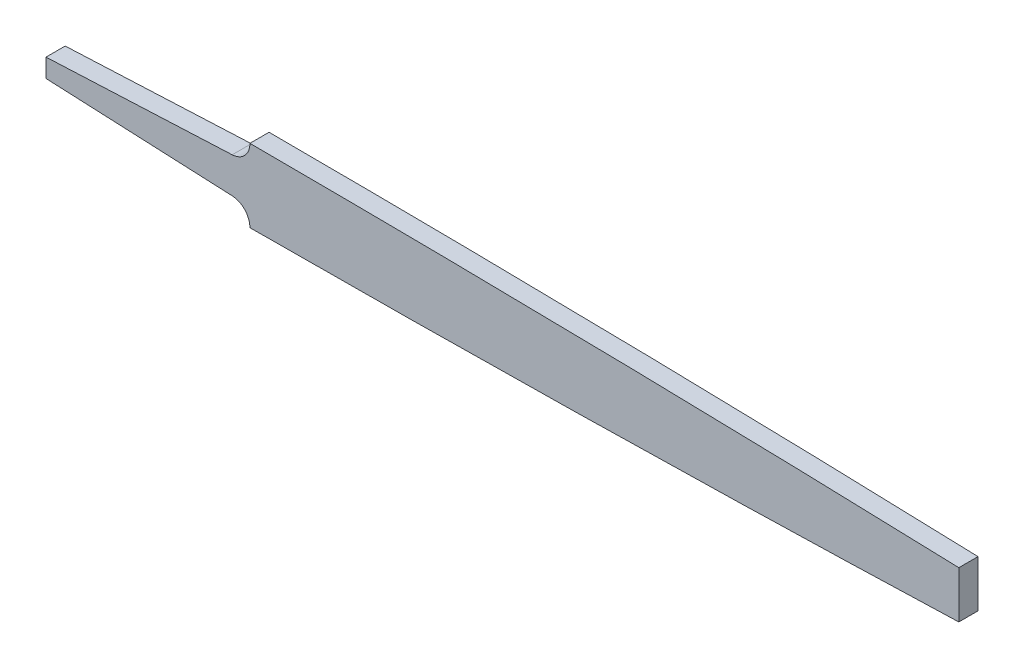
ISO-10303-21;
HEADER;
FILE_DESCRIPTION(('STEP AP214'),'2;1');
FILE_NAME('part.step','',(''),(''),'','','');
FILE_SCHEMA(('AUTOMOTIVE_DESIGN { 1 0 10303 214 1 1 1 1 }'));
ENDSEC;
DATA;
#1=APPLICATION_CONTEXT('core data for automotive mechanical design processes');
#2=APPLICATION_PROTOCOL_DEFINITION('international standard','automotive_design',2000,#1);
#3=PRODUCT_CONTEXT('',#1,'mechanical');
#4=PRODUCT('Part','Part','',(#3));
#5=PRODUCT_RELATED_PRODUCT_CATEGORY('part','',(#4));
#6=PRODUCT_DEFINITION_FORMATION('','',#4);
#7=PRODUCT_DEFINITION_CONTEXT('part definition',#1,'design');
#8=PRODUCT_DEFINITION('design','',#6,#7);
#9=PRODUCT_DEFINITION_SHAPE('','',#8);
#10=(LENGTH_UNIT() NAMED_UNIT(*) SI_UNIT(.MILLI.,.METRE.));
#11=(NAMED_UNIT(*) PLANE_ANGLE_UNIT() SI_UNIT($,.RADIAN.));
#12=(NAMED_UNIT(*) SI_UNIT($,.STERADIAN.) SOLID_ANGLE_UNIT());
#13=UNCERTAINTY_MEASURE_WITH_UNIT(LENGTH_MEASURE(1.E-05),#10,'distance_accuracy_value','');
#14=(GEOMETRIC_REPRESENTATION_CONTEXT(3) GLOBAL_UNCERTAINTY_ASSIGNED_CONTEXT((#13)) GLOBAL_UNIT_ASSIGNED_CONTEXT((#10,
#11,#12)) REPRESENTATION_CONTEXT('',''));
#15=CARTESIAN_POINT('',(0.,0.,0.));
#16=DIRECTION('',(0.,0.,1.));
#17=DIRECTION('',(1.,0.,0.));
#18=AXIS2_PLACEMENT_3D('',#15,#16,#17);
#19=CARTESIAN_POINT('',(-54.5,-7.885,-2.07));
#20=CARTESIAN_POINT('',(22.0288871676424,-7.68071876291531,-2.07));
#21=CARTESIAN_POINT('',(98.5,-5.07500000000003,-2.07));
#22=B_SPLINE_CURVE_WITH_KNOTS('',2,(#19,#20,#21),.UNSPECIFIED.,.F.,.F.,(3,3),(0.,1.),.UNSPECIFIED.);
#23=DIRECTION('',(0.,0.,1.));
#24=VECTOR('',#23,1.);
#25=SURFACE_OF_LINEAR_EXTRUSION('',#22,#24);
#26=DIRECTION('',(0.,0.,1.));
#27=VECTOR('',#26,1.);
#28=CARTESIAN_POINT('',(98.5,-5.07499999999998,-2.07));
#29=LINE('',#28,#27);
#30=CARTESIAN_POINT('',(98.5,-5.07499999999998,-2.07));
#31=VERTEX_POINT('',#30);
#32=CARTESIAN_POINT('',(98.5,-5.07499999999998,2.07));
#33=VERTEX_POINT('',#32);
#34=EDGE_CURVE('E41',#31,#33,#29,.T.);
#35=ORIENTED_EDGE('',*,*,#34,.T.);
#36=CARTESIAN_POINT('',(-54.5,-7.885,2.07));
#37=CARTESIAN_POINT('',(22.0288871676424,-7.68071876291531,2.07));
#38=CARTESIAN_POINT('',(98.5,-5.07500000000003,2.07));
#39=B_SPLINE_CURVE_WITH_KNOTS('',2,(#36,#37,#38),.UNSPECIFIED.,.F.,.F.,(3,3),(0.,1.),.UNSPECIFIED.);
#40=CARTESIAN_POINT('',(-54.5,-7.88499999999999,2.07));
#41=VERTEX_POINT('',#40);
#42=EDGE_CURVE('E114',#41,#33,#39,.T.);
#43=ORIENTED_EDGE('',*,*,#42,.F.);
#44=DIRECTION('',(0.,0.,1.));
#45=VECTOR('',#44,1.);
#46=CARTESIAN_POINT('',(-54.5,-7.88499999999999,-2.07));
#47=LINE('',#46,#45);
#48=CARTESIAN_POINT('',(-54.5,-7.88499999999999,-2.07));
#49=VERTEX_POINT('',#48);
#50=EDGE_CURVE('E11',#49,#41,#47,.T.);
#51=ORIENTED_EDGE('',*,*,#50,.F.);
#52=EDGE_CURVE('E115',#49,#31,#22,.T.);
#53=ORIENTED_EDGE('',*,*,#52,.T.);
#54=EDGE_LOOP('',(#35,#43,#51,#53));
#55=FACE_BOUND('',#54,.T.);
#56=ADVANCED_FACE('F37',(#55),#25,.T.);
#57=CARTESIAN_POINT('',(-54.5,-7.83083562232905,-2.07));
#58=DIRECTION('',(-1.,-2.56216140654763E-13,0.));
#59=DIRECTION('',(2.56216140654763E-13,-1.,0.));
#60=AXIS2_PLACEMENT_3D('',#57,#58,#59);
#61=PLANE('',#60);
#62=ORIENTED_EDGE('',*,*,#50,.T.);
#63=DIRECTION('',(2.56216140654763E-13,-1.,0.));
#64=VECTOR('',#63,1.);
#65=CARTESIAN_POINT('',(-54.5,-7.83083562232905,2.07));
#66=LINE('',#65,#64);
#67=CARTESIAN_POINT('',(-54.5,-7.83083562232905,2.07));
#68=VERTEX_POINT('',#67);
#69=EDGE_CURVE('E132',#68,#41,#66,.T.);
#70=ORIENTED_EDGE('',*,*,#69,.F.);
#71=DIRECTION('',(0.,0.,1.));
#72=VECTOR('',#71,1.);
#73=CARTESIAN_POINT('',(-54.5,-7.83083562232905,-2.07));
#74=LINE('',#73,#72);
#75=CARTESIAN_POINT('',(-54.5,-7.83083562232905,-2.07));
#76=VERTEX_POINT('',#75);
#77=EDGE_CURVE('E46',#76,#68,#74,.T.);
#78=ORIENTED_EDGE('',*,*,#77,.F.);
#79=DIRECTION('',(2.56216140654763E-13,-1.,0.));
#80=VECTOR('',#79,1.);
#81=CARTESIAN_POINT('',(-54.5,-7.83083562232905,-2.07));
#82=LINE('',#81,#80);
#83=EDGE_CURVE('E120',#76,#49,#82,.T.);
#84=ORIENTED_EDGE('',*,*,#83,.T.);
#85=EDGE_LOOP('',(#62,#70,#78,#84));
#86=FACE_BOUND('',#85,.T.);
#87=ADVANCED_FACE('F198',(#86),#61,.T.);
#88=CARTESIAN_POINT('',(-58.5,-7.83083562232905,-2.07));
#89=DIRECTION('',(0.,0.,1.));
#90=DIRECTION('',(1.,0.,0.));
#91=AXIS2_PLACEMENT_3D('',#88,#89,#90);
#92=CYLINDRICAL_SURFACE('',#91,4.);
#93=ORIENTED_EDGE('',*,*,#77,.T.);
#94=CARTESIAN_POINT('',(-58.5,-7.83083562232905,2.07));
#95=DIRECTION('',(0.,0.,-1.));
#96=DIRECTION('',(1.,0.,0.));
#97=AXIS2_PLACEMENT_3D('',#94,#95,#96);
#98=CIRCLE('',#97,4.);
#99=CARTESIAN_POINT('',(-58.3175234828088,-3.835,2.07));
#100=VERTEX_POINT('',#99);
#101=EDGE_CURVE('E161',#100,#68,#98,.T.);
#102=ORIENTED_EDGE('',*,*,#101,.F.);
#103=DIRECTION('',(0.,0.,1.));
#104=VECTOR('',#103,1.);
#105=CARTESIAN_POINT('',(-58.3175234828088,-3.835,-2.07));
#106=LINE('',#105,#104);
#107=CARTESIAN_POINT('',(-58.3175234828088,-3.835,-2.07));
#108=VERTEX_POINT('',#107);
#109=EDGE_CURVE('E247',#108,#100,#106,.T.);
#110=ORIENTED_EDGE('',*,*,#109,.F.);
#111=CARTESIAN_POINT('',(-58.5,-7.83083562232905,-2.07));
#112=DIRECTION('',(0.,0.,-1.));
#113=DIRECTION('',(1.,0.,0.));
#114=AXIS2_PLACEMENT_3D('',#111,#112,#113);
#115=CIRCLE('',#114,4.);
#116=EDGE_CURVE('E263',#108,#76,#115,.T.);
#117=ORIENTED_EDGE('',*,*,#116,.T.);
#118=EDGE_LOOP('',(#93,#102,#110,#117));
#119=FACE_BOUND('',#118,.T.);
#120=ADVANCED_FACE('F202',(#119),#92,.F.);
#121=CARTESIAN_POINT('',(-98.5,-2.,-2.07));
#122=DIRECTION('',(-0.0456191292977974,-0.998958905582262,0.));
#123=DIRECTION('',(0.998958905582262,-0.0456191292977974,0.));
#124=AXIS2_PLACEMENT_3D('',#121,#122,#123);
#125=PLANE('',#124);
#126=ORIENTED_EDGE('',*,*,#109,.T.);
#127=DIRECTION('',(0.998958905582262,-0.0456191292977974,0.));
#128=VECTOR('',#127,1.);
#129=CARTESIAN_POINT('',(-98.5,-2.,2.07));
#130=LINE('',#129,#128);
#131=CARTESIAN_POINT('',(-98.5,-2.,2.07));
#132=VERTEX_POINT('',#131);
#133=EDGE_CURVE('E158',#132,#100,#130,.T.);
#134=ORIENTED_EDGE('',*,*,#133,.F.);
#135=DIRECTION('',(0.,0.,1.));
#136=VECTOR('',#135,1.);
#137=CARTESIAN_POINT('',(-98.5,-2.,-2.07));
#138=LINE('',#137,#136);
#139=CARTESIAN_POINT('',(-98.5,-2.,-2.07));
#140=VERTEX_POINT('',#139);
#141=EDGE_CURVE('E245',#140,#132,#138,.T.);
#142=ORIENTED_EDGE('',*,*,#141,.F.);
#143=DIRECTION('',(0.998958905582262,-0.0456191292977974,0.));
#144=VECTOR('',#143,1.);
#145=CARTESIAN_POINT('',(-98.5,-2.,-2.07));
#146=LINE('',#145,#144);
#147=EDGE_CURVE('E260',#140,#108,#146,.T.);
#148=ORIENTED_EDGE('',*,*,#147,.T.);
#149=EDGE_LOOP('',(#126,#134,#142,#148));
#150=FACE_BOUND('',#149,.T.);
#151=ADVANCED_FACE('F207',(#150),#125,.T.);
#152=CARTESIAN_POINT('',(-98.5,-2.,-2.07));
#153=DIRECTION('',(-1.,0.,0.));
#154=DIRECTION('',(0.,0.,1.));
#155=AXIS2_PLACEMENT_3D('',#152,#153,#154);
#156=PLANE('',#155);
#157=ORIENTED_EDGE('',*,*,#141,.T.);
#158=DIRECTION('',(0.,-1.,0.));
#159=VECTOR('',#158,1.);
#160=CARTESIAN_POINT('',(-98.5,-2.,2.07));
#161=LINE('',#160,#159);
#162=CARTESIAN_POINT('',(-98.5,2.,2.07));
#163=VERTEX_POINT('',#162);
#164=EDGE_CURVE('E155',#163,#132,#161,.T.);
#165=ORIENTED_EDGE('',*,*,#164,.F.);
#166=DIRECTION('',(0.,0.,1.));
#167=VECTOR('',#166,1.);
#168=CARTESIAN_POINT('',(-98.5,2.,-2.07));
#169=LINE('',#168,#167);
#170=CARTESIAN_POINT('',(-98.5,2.,-2.07));
#171=VERTEX_POINT('',#170);
#172=EDGE_CURVE('E237',#171,#163,#169,.T.);
#173=ORIENTED_EDGE('',*,*,#172,.F.);
#174=DIRECTION('',(0.,-1.,0.));
#175=VECTOR('',#174,1.);
#176=CARTESIAN_POINT('',(-98.5,-2.,-2.07));
#177=LINE('',#176,#175);
#178=EDGE_CURVE('E256',#171,#140,#177,.T.);
#179=ORIENTED_EDGE('',*,*,#178,.T.);
#180=EDGE_LOOP('',(#157,#165,#173,#179));
#181=FACE_BOUND('',#180,.T.);
#182=ADVANCED_FACE('F214',(#181),#156,.T.);
#183=CARTESIAN_POINT('',(-98.5,2.,-2.07));
#184=DIRECTION('',(-0.0456191292977974,0.998958905582262,0.));
#185=DIRECTION('',(-0.998958905582262,-0.0456191292977974,0.));
#186=AXIS2_PLACEMENT_3D('',#183,#184,#185);
#187=PLANE('',#186);
#188=ORIENTED_EDGE('',*,*,#172,.T.);
#189=DIRECTION('',(-0.998958905582262,-0.0456191292977974,0.));
#190=VECTOR('',#189,1.);
#191=CARTESIAN_POINT('',(-98.5,2.,2.07));
#192=LINE('',#191,#190);
#193=CARTESIAN_POINT('',(-58.3175234828088,3.835,2.07));
#194=VERTEX_POINT('',#193);
#195=EDGE_CURVE('E152',#194,#163,#192,.T.);
#196=ORIENTED_EDGE('',*,*,#195,.F.);
#197=DIRECTION('',(0.,0.,1.));
#198=VECTOR('',#197,1.);
#199=CARTESIAN_POINT('',(-58.3175234828088,3.835,-2.07));
#200=LINE('',#199,#198);
#201=CARTESIAN_POINT('',(-58.3175234828088,3.835,-2.07));
#202=VERTEX_POINT('',#201);
#203=EDGE_CURVE('E231',#202,#194,#200,.T.);
#204=ORIENTED_EDGE('',*,*,#203,.F.);
#205=DIRECTION('',(-0.998958905582262,-0.0456191292977974,0.));
#206=VECTOR('',#205,1.);
#207=CARTESIAN_POINT('',(-98.5,2.,-2.07));
#208=LINE('',#207,#206);
#209=EDGE_CURVE('E242',#202,#171,#208,.T.);
#210=ORIENTED_EDGE('',*,*,#209,.T.);
#211=EDGE_LOOP('',(#188,#196,#204,#210));
#212=FACE_BOUND('',#211,.T.);
#213=ADVANCED_FACE('F218',(#212),#187,.T.);
#214=CARTESIAN_POINT('',(-58.5,7.83083562232905,-2.07));
#215=DIRECTION('',(0.,0.,1.));
#216=DIRECTION('',(1.,0.,0.));
#217=AXIS2_PLACEMENT_3D('',#214,#215,#216);
#218=CYLINDRICAL_SURFACE('',#217,4.);
#219=ORIENTED_EDGE('',*,*,#203,.T.);
#220=CARTESIAN_POINT('',(-58.5,7.83083562232905,2.07));
#221=DIRECTION('',(0.,0.,-1.));
#222=DIRECTION('',(1.,0.,0.));
#223=AXIS2_PLACEMENT_3D('',#220,#221,#222);
#224=CIRCLE('',#223,4.);
#225=CARTESIAN_POINT('',(-54.5,7.83083562232905,2.07));
#226=VERTEX_POINT('',#225);
#227=EDGE_CURVE('E149',#226,#194,#224,.T.);
#228=ORIENTED_EDGE('',*,*,#227,.F.);
#229=DIRECTION('',(0.,0.,1.));
#230=VECTOR('',#229,1.);
#231=CARTESIAN_POINT('',(-54.5,7.83083562232905,-2.07));
#232=LINE('',#231,#230);
#233=CARTESIAN_POINT('',(-54.5,7.83083562232905,-2.07));
#234=VERTEX_POINT('',#233);
#235=EDGE_CURVE('E238',#234,#226,#232,.T.);
#236=ORIENTED_EDGE('',*,*,#235,.F.);
#237=CARTESIAN_POINT('',(-58.5,7.83083562232905,-2.07));
#238=DIRECTION('',(0.,0.,-1.));
#239=DIRECTION('',(1.,0.,0.));
#240=AXIS2_PLACEMENT_3D('',#237,#238,#239);
#241=CIRCLE('',#240,4.);
#242=EDGE_CURVE('E233',#234,#202,#241,.T.);
#243=ORIENTED_EDGE('',*,*,#242,.T.);
#244=EDGE_LOOP('',(#219,#228,#236,#243));
#245=FACE_BOUND('',#244,.T.);
#246=ADVANCED_FACE('F221',(#245),#218,.F.);
#247=CARTESIAN_POINT('',(-54.5,7.83083562232905,-2.07));
#248=DIRECTION('',(-1.,2.56216140654697E-13,0.));
#249=DIRECTION('',(-2.56216140654697E-13,-1.,0.));
#250=AXIS2_PLACEMENT_3D('',#247,#248,#249);
#251=PLANE('',#250);
#252=ORIENTED_EDGE('',*,*,#235,.T.);
#253=DIRECTION('',(-2.56216140654697E-13,-1.,0.));
#254=VECTOR('',#253,1.);
#255=CARTESIAN_POINT('',(-54.5,7.83083562232905,2.07));
#256=LINE('',#255,#254);
#257=CARTESIAN_POINT('',(-54.5,7.885,2.07));
#258=VERTEX_POINT('',#257);
#259=EDGE_CURVE('E143',#258,#226,#256,.T.);
#260=ORIENTED_EDGE('',*,*,#259,.F.);
#261=DIRECTION('',(0.,0.,1.));
#262=VECTOR('',#261,1.);
#263=CARTESIAN_POINT('',(-54.5,7.885,-2.07));
#264=LINE('',#263,#262);
#265=CARTESIAN_POINT('',(-54.5,7.885,-2.07));
#266=VERTEX_POINT('',#265);
#267=EDGE_CURVE('E252',#266,#258,#264,.T.);
#268=ORIENTED_EDGE('',*,*,#267,.F.);
#269=DIRECTION('',(-2.56216140654697E-13,-1.,0.));
#270=VECTOR('',#269,1.);
#271=CARTESIAN_POINT('',(-54.5,7.83083562232905,-2.07));
#272=LINE('',#271,#270);
#273=EDGE_CURVE('E178',#266,#234,#272,.T.);
#274=ORIENTED_EDGE('',*,*,#273,.T.);
#275=EDGE_LOOP('',(#252,#260,#268,#274));
#276=FACE_BOUND('',#275,.T.);
#277=ADVANCED_FACE('F187',(#276),#251,.T.);
#278=CARTESIAN_POINT('',(98.5,5.07500000000003,-2.07));
#279=CARTESIAN_POINT('',(22.0288871676424,7.68071876291531,-2.07));
#280=CARTESIAN_POINT('',(-54.5,7.885,-2.07));
#281=B_SPLINE_CURVE_WITH_KNOTS('',2,(#278,#279,#280),.UNSPECIFIED.,.F.,.F.,(3,3),(0.,1.),.UNSPECIFIED.);
#282=DIRECTION('',(0.,0.,1.));
#283=VECTOR('',#282,1.);
#284=SURFACE_OF_LINEAR_EXTRUSION('',#281,#283);
#285=ORIENTED_EDGE('',*,*,#267,.T.);
#286=CARTESIAN_POINT('',(98.5,5.07500000000003,2.07));
#287=CARTESIAN_POINT('',(22.0288871676424,7.68071876291531,2.07));
#288=CARTESIAN_POINT('',(-54.5,7.885,2.07));
#289=B_SPLINE_CURVE_WITH_KNOTS('',2,(#286,#287,#288),.UNSPECIFIED.,.F.,.F.,(3,3),(0.,1.),.UNSPECIFIED.);
#290=CARTESIAN_POINT('',(98.5,5.07500000000004,2.07));
#291=VERTEX_POINT('',#290);
#292=EDGE_CURVE('E127',#291,#258,#289,.T.);
#293=ORIENTED_EDGE('',*,*,#292,.F.);
#294=DIRECTION('',(0.,0.,1.));
#295=VECTOR('',#294,1.);
#296=CARTESIAN_POINT('',(98.5,5.07500000000004,-2.07));
#297=LINE('',#296,#295);
#298=CARTESIAN_POINT('',(98.5,5.07500000000004,-2.07));
#299=VERTEX_POINT('',#298);
#300=EDGE_CURVE('E119',#299,#291,#297,.T.);
#301=ORIENTED_EDGE('',*,*,#300,.F.);
#302=EDGE_CURVE('E172',#299,#266,#281,.T.);
#303=ORIENTED_EDGE('',*,*,#302,.T.);
#304=EDGE_LOOP('',(#285,#293,#301,#303));
#305=FACE_BOUND('',#304,.T.);
#306=ADVANCED_FACE('F184',(#305),#284,.T.);
#307=CARTESIAN_POINT('',(98.5,5.07500000000004,-2.07));
#308=DIRECTION('',(1.,0.,0.));
#309=DIRECTION('',(0.,0.,-1.));
#310=AXIS2_PLACEMENT_3D('',#307,#308,#309);
#311=PLANE('',#310);
#312=ORIENTED_EDGE('',*,*,#300,.T.);
#313=DIRECTION('',(0.,1.,0.));
#314=VECTOR('',#313,1.);
#315=CARTESIAN_POINT('',(98.5,5.07500000000004,2.07));
#316=LINE('',#315,#314);
#317=EDGE_CURVE('E122',#33,#291,#316,.T.);
#318=ORIENTED_EDGE('',*,*,#317,.F.);
#319=ORIENTED_EDGE('',*,*,#34,.F.);
#320=DIRECTION('',(0.,1.,0.));
#321=VECTOR('',#320,1.);
#322=CARTESIAN_POINT('',(98.5,5.07500000000004,-2.07));
#323=LINE('',#322,#321);
#324=EDGE_CURVE('E167',#31,#299,#323,.T.);
#325=ORIENTED_EDGE('',*,*,#324,.T.);
#326=EDGE_LOOP('',(#312,#318,#319,#325));
#327=FACE_BOUND('',#326,.T.);
#328=ADVANCED_FACE('F123',(#327),#311,.T.);
#329=CARTESIAN_POINT('',(22.0144435838212,-7.08035938145766,-2.07));
#330=DIRECTION('',(0.,0.,-1.));
#331=DIRECTION('',(-1.,0.,0.));
#332=AXIS2_PLACEMENT_3D('',#329,#330,#331);
#333=PLANE('',#332);
#334=ORIENTED_EDGE('',*,*,#52,.F.);
#335=ORIENTED_EDGE('',*,*,#83,.F.);
#336=ORIENTED_EDGE('',*,*,#116,.F.);
#337=ORIENTED_EDGE('',*,*,#147,.F.);
#338=ORIENTED_EDGE('',*,*,#178,.F.);
#339=ORIENTED_EDGE('',*,*,#209,.F.);
#340=ORIENTED_EDGE('',*,*,#242,.F.);
#341=ORIENTED_EDGE('',*,*,#273,.F.);
#342=ORIENTED_EDGE('',*,*,#302,.F.);
#343=ORIENTED_EDGE('',*,*,#324,.F.);
#344=EDGE_LOOP('',(#334,#335,#336,#337,#338,#339,#340,#341,#342,#343));
#345=FACE_BOUND('',#344,.T.);
#346=ADVANCED_FACE('F191',(#345),#333,.T.);
#347=CARTESIAN_POINT('',(22.0144435838212,-7.08035938145766,2.07));
#348=DIRECTION('',(0.,0.,-1.));
#349=DIRECTION('',(-1.,0.,0.));
#350=AXIS2_PLACEMENT_3D('',#347,#348,#349);
#351=PLANE('',#350);
#352=ORIENTED_EDGE('',*,*,#42,.T.);
#353=ORIENTED_EDGE('',*,*,#317,.T.);
#354=ORIENTED_EDGE('',*,*,#292,.T.);
#355=ORIENTED_EDGE('',*,*,#259,.T.);
#356=ORIENTED_EDGE('',*,*,#227,.T.);
#357=ORIENTED_EDGE('',*,*,#195,.T.);
#358=ORIENTED_EDGE('',*,*,#164,.T.);
#359=ORIENTED_EDGE('',*,*,#133,.T.);
#360=ORIENTED_EDGE('',*,*,#101,.T.);
#361=ORIENTED_EDGE('',*,*,#69,.T.);
#362=EDGE_LOOP('',(#352,#353,#354,#355,#356,#357,#358,#359,#360,#361));
#363=FACE_BOUND('',#362,.T.);
#364=ADVANCED_FACE('F130',(#363),#351,.F.);
#365=CLOSED_SHELL('',(#56,#87,#120,#151,#182,#213,#246,#277,#306,#328,#346,#364));
#366=MANIFOLD_SOLID_BREP('B2',#365);
#367=ADVANCED_BREP_SHAPE_REPRESENTATION('',(#18,#366),#14);
#368=SHAPE_DEFINITION_REPRESENTATION(#9,#367);
ENDSEC;
END-ISO-10303-21;
